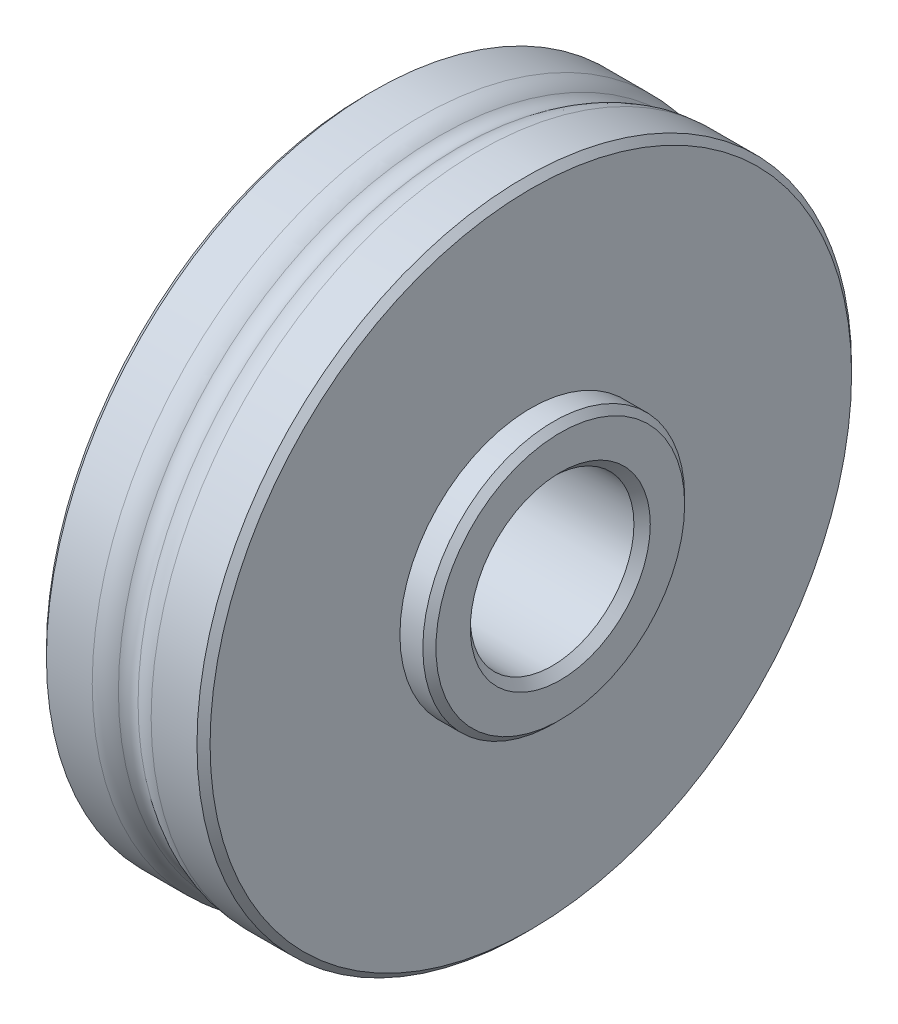
ISO-10303-21;
HEADER;
FILE_DESCRIPTION(('STEP AP214'),'2;1');
FILE_NAME('part.step','',(''),(''),'','','');
FILE_SCHEMA(('AUTOMOTIVE_DESIGN { 1 0 10303 214 1 1 1 1 }'));
ENDSEC;
DATA;
#1=APPLICATION_CONTEXT('core data for automotive mechanical design processes');
#2=APPLICATION_PROTOCOL_DEFINITION('international standard','automotive_design',2000,#1);
#3=PRODUCT_CONTEXT('',#1,'mechanical');
#4=PRODUCT('Part','Part','',(#3));
#5=PRODUCT_RELATED_PRODUCT_CATEGORY('part','',(#4));
#6=PRODUCT_DEFINITION_FORMATION('','',#4);
#7=PRODUCT_DEFINITION_CONTEXT('part definition',#1,'design');
#8=PRODUCT_DEFINITION('design','',#6,#7);
#9=PRODUCT_DEFINITION_SHAPE('','',#8);
#10=(LENGTH_UNIT() NAMED_UNIT(*) SI_UNIT(.MILLI.,.METRE.));
#11=(NAMED_UNIT(*) PLANE_ANGLE_UNIT() SI_UNIT($,.RADIAN.));
#12=(NAMED_UNIT(*) SI_UNIT($,.STERADIAN.) SOLID_ANGLE_UNIT());
#13=UNCERTAINTY_MEASURE_WITH_UNIT(LENGTH_MEASURE(1.E-05),#10,'distance_accuracy_value','');
#14=(GEOMETRIC_REPRESENTATION_CONTEXT(3) GLOBAL_UNCERTAINTY_ASSIGNED_CONTEXT((#13)) GLOBAL_UNIT_ASSIGNED_CONTEXT((#10,
#11,#12)) REPRESENTATION_CONTEXT('',''));
#15=CARTESIAN_POINT('',(0.,0.,0.));
#16=DIRECTION('',(0.,0.,1.));
#17=DIRECTION('',(1.,0.,0.));
#18=AXIS2_PLACEMENT_3D('',#15,#16,#17);
#19=CARTESIAN_POINT('',(-3.40000000000001,0.,-6.19999999999999));
#20=DIRECTION('',(-1.,0.,0.));
#21=DIRECTION('',(0.,0.,1.));
#22=AXIS2_PLACEMENT_3D('',#19,#20,#21);
#23=PLANE('',#22);
#24=CARTESIAN_POINT('',(-3.4,0.,-10.2));
#25=DIRECTION('',(1.,0.,0.));
#26=DIRECTION('',(0.,0.,-1.));
#27=AXIS2_PLACEMENT_3D('',#24,#25,#26);
#28=CIRCLE('',#27,2.75);
#29=CARTESIAN_POINT('',(-3.39999999999999,0.,-12.95));
#30=VERTEX_POINT('',#29);
#31=EDGE_CURVE('E128',#30,#30,#28,.T.);
#32=ORIENTED_EDGE('',*,*,#31,.T.);
#33=EDGE_LOOP('',(#32));
#34=FACE_BOUND('',#33,.T.);
#35=CARTESIAN_POINT('',(-3.4,0.,-10.2));
#36=DIRECTION('',(-1.,0.,0.));
#37=DIRECTION('',(0.,0.,1.));
#38=AXIS2_PLACEMENT_3D('',#35,#36,#37);
#39=CIRCLE('',#38,3.79999999999999);
#40=CARTESIAN_POINT('',(-3.40000000000001,0.,-6.4));
#41=VERTEX_POINT('',#40);
#42=EDGE_CURVE('E88',#41,#41,#39,.T.);
#43=ORIENTED_EDGE('',*,*,#42,.T.);
#44=EDGE_LOOP('',(#43));
#45=FACE_BOUND('',#44,.T.);
#46=ADVANCED_FACE('F49',(#34,#45),#23,.T.);
#47=CARTESIAN_POINT('',(-6.50000000000003,0.,-10.2));
#48=DIRECTION('',(-1.,0.,0.));
#49=DIRECTION('',(0.,0.,1.));
#50=AXIS2_PLACEMENT_3D('',#47,#48,#49);
#51=CYLINDRICAL_SURFACE('',#50,4.);
#52=CARTESIAN_POINT('',(-3.19999999999999,0.,-10.2));
#53=DIRECTION('',(-1.,0.,0.));
#54=DIRECTION('',(0.,0.,1.));
#55=AXIS2_PLACEMENT_3D('',#52,#53,#54);
#56=CIRCLE('',#55,4.);
#57=CARTESIAN_POINT('',(-3.19999999999999,0.,-6.19999999999999));
#58=VERTEX_POINT('',#57);
#59=EDGE_CURVE('E84',#58,#58,#56,.F.);
#60=ORIENTED_EDGE('',*,*,#59,.T.);
#61=EDGE_LOOP('',(#60));
#62=FACE_BOUND('',#61,.T.);
#63=CARTESIAN_POINT('',(-2.5,0.,-10.2));
#64=DIRECTION('',(-1.,0.,0.));
#65=DIRECTION('',(0.,0.,1.));
#66=AXIS2_PLACEMENT_3D('',#63,#64,#65);
#67=CIRCLE('',#66,4.);
#68=CARTESIAN_POINT('',(-2.50000000000001,0.,-6.19999999999999));
#69=VERTEX_POINT('',#68);
#70=EDGE_CURVE('E92',#69,#69,#67,.T.);
#71=ORIENTED_EDGE('',*,*,#70,.T.);
#72=EDGE_LOOP('',(#71));
#73=FACE_BOUND('',#72,.T.);
#74=ADVANCED_FACE('F183',(#62,#73),#51,.T.);
#75=CARTESIAN_POINT('',(-2.50000000000001,0.,-0.199999999999999));
#76=DIRECTION('',(-1.,0.,0.));
#77=DIRECTION('',(0.,0.,1.));
#78=AXIS2_PLACEMENT_3D('',#75,#76,#77);
#79=PLANE('',#78);
#80=CARTESIAN_POINT('',(-2.49999999999999,0.,-10.2));
#81=DIRECTION('',(-1.,0.,0.));
#82=DIRECTION('',(0.,0.,1.));
#83=AXIS2_PLACEMENT_3D('',#80,#81,#82);
#84=CIRCLE('',#83,9.79999999999997);
#85=CARTESIAN_POINT('',(-2.50000000000001,0.,-0.400000000000029));
#86=VERTEX_POINT('',#85);
#87=EDGE_CURVE('E80',#86,#86,#84,.T.);
#88=ORIENTED_EDGE('',*,*,#87,.T.);
#89=EDGE_LOOP('',(#88));
#90=FACE_BOUND('',#89,.T.);
#91=ORIENTED_EDGE('',*,*,#70,.F.);
#92=EDGE_LOOP('',(#91));
#93=FACE_BOUND('',#92,.T.);
#94=ADVANCED_FACE('F188',(#90,#93),#79,.T.);
#95=CARTESIAN_POINT('',(-6.50000000000003,0.,-10.2));
#96=DIRECTION('',(-1.,0.,0.));
#97=DIRECTION('',(0.,0.,1.));
#98=AXIS2_PLACEMENT_3D('',#95,#96,#97);
#99=CYLINDRICAL_SURFACE('',#98,9.99999999999999);
#100=CARTESIAN_POINT('',(-2.29999999999999,0.,-10.2));
#101=DIRECTION('',(-1.,0.,0.));
#102=DIRECTION('',(0.,0.,1.));
#103=AXIS2_PLACEMENT_3D('',#100,#101,#102);
#104=CIRCLE('',#103,9.99999999999999);
#105=CARTESIAN_POINT('',(-2.29999999999999,0.,-0.200000000000001));
#106=VERTEX_POINT('',#105);
#107=EDGE_CURVE('E76',#106,#106,#104,.F.);
#108=ORIENTED_EDGE('',*,*,#107,.T.);
#109=EDGE_LOOP('',(#108));
#110=FACE_BOUND('',#109,.T.);
#111=CARTESIAN_POINT('',(-0.899999999999981,0.,-10.2));
#112=DIRECTION('',(-1.,0.,0.));
#113=DIRECTION('',(0.,0.,1.));
#114=AXIS2_PLACEMENT_3D('',#111,#112,#113);
#115=CIRCLE('',#114,9.99999999999999);
#116=CARTESIAN_POINT('',(-0.899999999999998,0.,-0.199999999999999));
#117=VERTEX_POINT('',#116);
#118=EDGE_CURVE('E96',#117,#117,#115,.T.);
#119=ORIENTED_EDGE('',*,*,#118,.T.);
#120=EDGE_LOOP('',(#119));
#121=FACE_BOUND('',#120,.T.);
#122=ADVANCED_FACE('F217',(#110,#121),#99,.T.);
#123=CARTESIAN_POINT('',(-0.899999999999982,0.,-10.2));
#124=DIRECTION('',(-1.,0.,0.));
#125=DIRECTION('',(0.,0.,1.));
#126=AXIS2_PLACEMENT_3D('',#123,#124,#125);
#127=TOROIDAL_SURFACE('',#126,8.99999999999999,1.);
#128=CARTESIAN_POINT('',(-0.299999999999983,0.,-10.2));
#129=DIRECTION('',(-1.,0.,0.));
#130=DIRECTION('',(0.,0.,1.));
#131=AXIS2_PLACEMENT_3D('',#128,#129,#130);
#132=CIRCLE('',#131,9.79999999999999);
#133=CARTESIAN_POINT('',(-0.3,0.,-0.399999999999998));
#134=VERTEX_POINT('',#133);
#135=EDGE_CURVE('E100',#134,#134,#132,.T.);
#136=ORIENTED_EDGE('',*,*,#135,.T.);
#137=EDGE_LOOP('',(#136));
#138=FACE_BOUND('',#137,.T.);
#139=ORIENTED_EDGE('',*,*,#118,.F.);
#140=EDGE_LOOP('',(#139));
#141=FACE_BOUND('',#140,.T.);
#142=ADVANCED_FACE('F223',(#138,#141),#127,.T.);
#143=CARTESIAN_POINT('',(0.,0.,-10.2));
#144=DIRECTION('',(-1.,0.,0.));
#145=DIRECTION('',(0.,0.,1.));
#146=AXIS2_PLACEMENT_3D('',#143,#144,#145);
#147=TOROIDAL_SURFACE('',#146,10.2,0.499999999999999);
#148=CARTESIAN_POINT('',(0.300000000000019,0.,-10.2));
#149=DIRECTION('',(-1.,0.,0.));
#150=DIRECTION('',(0.,0.,1.));
#151=AXIS2_PLACEMENT_3D('',#148,#149,#150);
#152=CIRCLE('',#151,9.79999999999999);
#153=CARTESIAN_POINT('',(0.300000000000002,0.,-0.399999999999998));
#154=VERTEX_POINT('',#153);
#155=EDGE_CURVE('E104',#154,#154,#152,.T.);
#156=ORIENTED_EDGE('',*,*,#155,.T.);
#157=EDGE_LOOP('',(#156));
#158=FACE_BOUND('',#157,.T.);
#159=ORIENTED_EDGE('',*,*,#135,.F.);
#160=EDGE_LOOP('',(#159));
#161=FACE_BOUND('',#160,.T.);
#162=ADVANCED_FACE('F229',(#158,#161),#147,.F.);
#163=CARTESIAN_POINT('',(0.900000000000014,0.,-10.2));
#164=DIRECTION('',(-1.,0.,0.));
#165=DIRECTION('',(0.,0.,1.));
#166=AXIS2_PLACEMENT_3D('',#163,#164,#165);
#167=TOROIDAL_SURFACE('',#166,8.99999999999999,1.);
#168=CARTESIAN_POINT('',(0.900000000000015,0.,-10.2));
#169=DIRECTION('',(-1.,0.,0.));
#170=DIRECTION('',(0.,0.,1.));
#171=AXIS2_PLACEMENT_3D('',#168,#169,#170);
#172=CIRCLE('',#171,9.99999999999999);
#173=CARTESIAN_POINT('',(0.899999999999998,0.,-0.199999999999999));
#174=VERTEX_POINT('',#173);
#175=EDGE_CURVE('E108',#174,#174,#172,.T.);
#176=ORIENTED_EDGE('',*,*,#175,.T.);
#177=EDGE_LOOP('',(#176));
#178=FACE_BOUND('',#177,.T.);
#179=ORIENTED_EDGE('',*,*,#155,.F.);
#180=EDGE_LOOP('',(#179));
#181=FACE_BOUND('',#180,.T.);
#182=ADVANCED_FACE('F180',(#178,#181),#167,.T.);
#183=CARTESIAN_POINT('',(-6.50000000000003,0.,-10.2));
#184=DIRECTION('',(-1.,0.,0.));
#185=DIRECTION('',(0.,0.,1.));
#186=AXIS2_PLACEMENT_3D('',#183,#184,#185);
#187=CYLINDRICAL_SURFACE('',#186,9.99999999999999);
#188=CARTESIAN_POINT('',(2.30000000000002,0.,-10.2));
#189=DIRECTION('',(1.,0.,0.));
#190=DIRECTION('',(0.,0.,-1.));
#191=AXIS2_PLACEMENT_3D('',#188,#189,#190);
#192=CIRCLE('',#191,9.99999999999999);
#193=CARTESIAN_POINT('',(2.30000000000002,0.,-20.2));
#194=VERTEX_POINT('',#193);
#195=EDGE_CURVE('E58',#194,#194,#192,.F.);
#196=ORIENTED_EDGE('',*,*,#195,.T.);
#197=EDGE_LOOP('',(#196));
#198=FACE_BOUND('',#197,.T.);
#199=ORIENTED_EDGE('',*,*,#175,.F.);
#200=EDGE_LOOP('',(#199));
#201=FACE_BOUND('',#200,.T.);
#202=ADVANCED_FACE('F175',(#198,#201),#187,.T.);
#203=CARTESIAN_POINT('',(2.50000000000001,0.,-6.19999999999999));
#204=DIRECTION('',(1.,0.,0.));
#205=DIRECTION('',(0.,0.,-1.));
#206=AXIS2_PLACEMENT_3D('',#203,#204,#205);
#207=PLANE('',#206);
#208=CARTESIAN_POINT('',(2.50000000000002,0.,-10.2));
#209=DIRECTION('',(1.,0.,0.));
#210=DIRECTION('',(0.,0.,-1.));
#211=AXIS2_PLACEMENT_3D('',#208,#209,#210);
#212=CIRCLE('',#211,9.8);
#213=CARTESIAN_POINT('',(2.50000000000003,0.,-20.));
#214=VERTEX_POINT('',#213);
#215=EDGE_CURVE('E12',#214,#214,#212,.T.);
#216=ORIENTED_EDGE('',*,*,#215,.T.);
#217=EDGE_LOOP('',(#216));
#218=FACE_BOUND('',#217,.T.);
#219=CARTESIAN_POINT('',(2.50000000000002,0.,-10.2));
#220=DIRECTION('',(-1.,0.,0.));
#221=DIRECTION('',(0.,0.,1.));
#222=AXIS2_PLACEMENT_3D('',#219,#220,#221);
#223=CIRCLE('',#222,3.99999999999999);
#224=CARTESIAN_POINT('',(2.50000000000001,0.,-6.19999999999999));
#225=VERTEX_POINT('',#224);
#226=EDGE_CURVE('E112',#225,#225,#223,.T.);
#227=ORIENTED_EDGE('',*,*,#226,.T.);
#228=EDGE_LOOP('',(#227));
#229=FACE_BOUND('',#228,.T.);
#230=ADVANCED_FACE('F170',(#218,#229),#207,.T.);
#231=CARTESIAN_POINT('',(-6.50000000000003,0.,-10.2));
#232=DIRECTION('',(-1.,0.,0.));
#233=DIRECTION('',(0.,0.,1.));
#234=AXIS2_PLACEMENT_3D('',#231,#232,#233);
#235=CYLINDRICAL_SURFACE('',#234,3.99999999999999);
#236=CARTESIAN_POINT('',(3.20000000000002,0.,-10.2));
#237=DIRECTION('',(1.,0.,0.));
#238=DIRECTION('',(0.,0.,-1.));
#239=AXIS2_PLACEMENT_3D('',#236,#237,#238);
#240=CIRCLE('',#239,3.99999999999999);
#241=CARTESIAN_POINT('',(3.20000000000002,0.,-14.2));
#242=VERTEX_POINT('',#241);
#243=EDGE_CURVE('E70',#242,#242,#240,.F.);
#244=ORIENTED_EDGE('',*,*,#243,.T.);
#245=EDGE_LOOP('',(#244));
#246=FACE_BOUND('',#245,.T.);
#247=ORIENTED_EDGE('',*,*,#226,.F.);
#248=EDGE_LOOP('',(#247));
#249=FACE_BOUND('',#248,.T.);
#250=ADVANCED_FACE('F158',(#246,#249),#235,.T.);
#251=CARTESIAN_POINT('',(3.40000000000002,0.,-10.2));
#252=DIRECTION('',(1.,0.,0.));
#253=DIRECTION('',(0.,0.,-1.));
#254=AXIS2_PLACEMENT_3D('',#251,#252,#253);
#255=PLANE('',#254);
#256=CARTESIAN_POINT('',(3.40000000000002,0.,-10.2));
#257=DIRECTION('',(1.,0.,0.));
#258=DIRECTION('',(0.,0.,-1.));
#259=AXIS2_PLACEMENT_3D('',#256,#257,#258);
#260=CIRCLE('',#259,2.75);
#261=CARTESIAN_POINT('',(3.40000000000002,0.,-12.95));
#262=VERTEX_POINT('',#261);
#263=EDGE_CURVE('E124',#262,#262,#260,.T.);
#264=ORIENTED_EDGE('',*,*,#263,.F.);
#265=EDGE_LOOP('',(#264));
#266=FACE_BOUND('',#265,.T.);
#267=CARTESIAN_POINT('',(3.40000000000002,0.,-10.2));
#268=DIRECTION('',(1.,0.,0.));
#269=DIRECTION('',(0.,0.,-1.));
#270=AXIS2_PLACEMENT_3D('',#267,#268,#269);
#271=CIRCLE('',#270,3.8);
#272=CARTESIAN_POINT('',(3.40000000000002,0.,-14.));
#273=VERTEX_POINT('',#272);
#274=EDGE_CURVE('E64',#273,#273,#271,.T.);
#275=ORIENTED_EDGE('',*,*,#274,.T.);
#276=EDGE_LOOP('',(#275));
#277=FACE_BOUND('',#276,.T.);
#278=ADVANCED_FACE('F154',(#266,#277),#255,.T.);
#279=CARTESIAN_POINT('',(-3.4,0.,-10.2));
#280=DIRECTION('',(1.,0.,0.));
#281=DIRECTION('',(0.,0.,-1.));
#282=AXIS2_PLACEMENT_3D('',#279,#280,#281);
#283=CONICAL_SURFACE('',#282,3.8,0.785398163397441);
#284=ORIENTED_EDGE('',*,*,#59,.F.);
#285=EDGE_LOOP('',(#284));
#286=FACE_BOUND('',#285,.T.);
#287=ORIENTED_EDGE('',*,*,#42,.F.);
#288=EDGE_LOOP('',(#287));
#289=FACE_BOUND('',#288,.T.);
#290=ADVANCED_FACE('F157',(#286,#289),#283,.T.);
#291=CARTESIAN_POINT('',(-2.49999999999999,0.,-10.2));
#292=DIRECTION('',(1.,0.,0.));
#293=DIRECTION('',(0.,0.,-1.));
#294=AXIS2_PLACEMENT_3D('',#291,#292,#293);
#295=CONICAL_SURFACE('',#294,9.79999999999998,0.785398163397466);
#296=ORIENTED_EDGE('',*,*,#107,.F.);
#297=EDGE_LOOP('',(#296));
#298=FACE_BOUND('',#297,.T.);
#299=ORIENTED_EDGE('',*,*,#87,.F.);
#300=EDGE_LOOP('',(#299));
#301=FACE_BOUND('',#300,.T.);
#302=ADVANCED_FACE('F165',(#298,#301),#295,.T.);
#303=CARTESIAN_POINT('',(3.20000000000002,0.,-10.2));
#304=DIRECTION('',(-1.,0.,0.));
#305=DIRECTION('',(0.,0.,1.));
#306=AXIS2_PLACEMENT_3D('',#303,#304,#305);
#307=CONICAL_SURFACE('',#306,3.99999999999999,0.785398163397455);
#308=ORIENTED_EDGE('',*,*,#274,.F.);
#309=EDGE_LOOP('',(#308));
#310=FACE_BOUND('',#309,.T.);
#311=ORIENTED_EDGE('',*,*,#243,.F.);
#312=EDGE_LOOP('',(#311));
#313=FACE_BOUND('',#312,.T.);
#314=ADVANCED_FACE('F162',(#310,#313),#307,.T.);
#315=CARTESIAN_POINT('',(2.30000000000002,0.,-10.2));
#316=DIRECTION('',(-1.,0.,0.));
#317=DIRECTION('',(0.,0.,1.));
#318=AXIS2_PLACEMENT_3D('',#315,#316,#317);
#319=CONICAL_SURFACE('',#318,9.99999999999999,0.785398163397466);
#320=ORIENTED_EDGE('',*,*,#215,.F.);
#321=EDGE_LOOP('',(#320));
#322=FACE_BOUND('',#321,.T.);
#323=ORIENTED_EDGE('',*,*,#195,.F.);
#324=EDGE_LOOP('',(#323));
#325=FACE_BOUND('',#324,.T.);
#326=ADVANCED_FACE('F52',(#322,#325),#319,.T.);
#327=CARTESIAN_POINT('',(-3.15,0.,-10.2));
#328=DIRECTION('',(-1.,0.,0.));
#329=DIRECTION('',(0.,0.,1.));
#330=AXIS2_PLACEMENT_3D('',#327,#328,#329);
#331=CONICAL_SURFACE('',#330,2.5,0.785398163397447);
#332=ORIENTED_EDGE('',*,*,#31,.F.);
#333=EDGE_LOOP('',(#332));
#334=FACE_BOUND('',#333,.T.);
#335=CARTESIAN_POINT('',(-3.15,0.,-10.2));
#336=DIRECTION('',(1.,0.,0.));
#337=DIRECTION('',(0.,0.,-1.));
#338=AXIS2_PLACEMENT_3D('',#335,#336,#337);
#339=CIRCLE('',#338,2.5);
#340=CARTESIAN_POINT('',(-3.14999999999999,0.,-12.7));
#341=VERTEX_POINT('',#340);
#342=EDGE_CURVE('E116',#341,#341,#339,.T.);
#343=ORIENTED_EDGE('',*,*,#342,.T.);
#344=EDGE_LOOP('',(#343));
#345=FACE_BOUND('',#344,.T.);
#346=ADVANCED_FACE('F136',(#334,#345),#331,.F.);
#347=CARTESIAN_POINT('',(3.40000000000002,0.,-10.2));
#348=DIRECTION('',(1.,0.,0.));
#349=DIRECTION('',(0.,0.,-1.));
#350=AXIS2_PLACEMENT_3D('',#347,#348,#349);
#351=CYLINDRICAL_SURFACE('',#350,2.5);
#352=ORIENTED_EDGE('',*,*,#342,.F.);
#353=EDGE_LOOP('',(#352));
#354=FACE_BOUND('',#353,.T.);
#355=CARTESIAN_POINT('',(3.15000000000002,0.,-10.2));
#356=DIRECTION('',(1.,0.,0.));
#357=DIRECTION('',(0.,0.,-1.));
#358=AXIS2_PLACEMENT_3D('',#355,#356,#357);
#359=CIRCLE('',#358,2.5);
#360=CARTESIAN_POINT('',(3.15000000000002,0.,-12.7));
#361=VERTEX_POINT('',#360);
#362=EDGE_CURVE('E120',#361,#361,#359,.T.);
#363=ORIENTED_EDGE('',*,*,#362,.T.);
#364=EDGE_LOOP('',(#363));
#365=FACE_BOUND('',#364,.T.);
#366=ADVANCED_FACE('F139',(#354,#365),#351,.F.);
#367=CARTESIAN_POINT('',(3.40000000000002,0.,-10.2));
#368=DIRECTION('',(1.,0.,0.));
#369=DIRECTION('',(0.,0.,-1.));
#370=AXIS2_PLACEMENT_3D('',#367,#368,#369);
#371=CONICAL_SURFACE('',#370,2.75,0.785398163397449);
#372=ORIENTED_EDGE('',*,*,#362,.F.);
#373=EDGE_LOOP('',(#372));
#374=FACE_BOUND('',#373,.T.);
#375=ORIENTED_EDGE('',*,*,#263,.T.);
#376=EDGE_LOOP('',(#375));
#377=FACE_BOUND('',#376,.T.);
#378=ADVANCED_FACE('F145',(#374,#377),#371,.F.);
#379=CLOSED_SHELL('',(#46,#74,#94,#122,#142,#162,#182,#202,#230,#250,#278,#290,#302,#314,#326,
#346,#366,#378));
#380=MANIFOLD_SOLID_BREP('B2',#379);
#381=ADVANCED_BREP_SHAPE_REPRESENTATION('',(#18,#380),#14);
#382=SHAPE_DEFINITION_REPRESENTATION(#9,#381);
ENDSEC;
END-ISO-10303-21;
